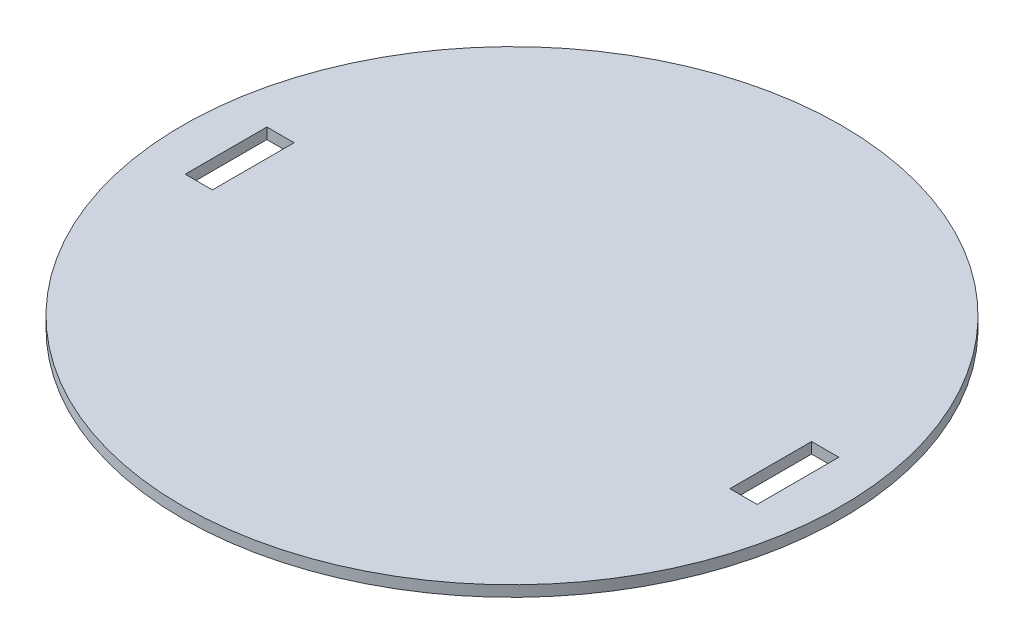
ISO-10303-21;
HEADER;
FILE_DESCRIPTION(('STEP AP214'),'2;1');
FILE_NAME('part.step','',(''),(''),'','','');
FILE_SCHEMA(('AUTOMOTIVE_DESIGN { 1 0 10303 214 1 1 1 1 }'));
ENDSEC;
DATA;
#1=APPLICATION_CONTEXT('core data for automotive mechanical design processes');
#2=APPLICATION_PROTOCOL_DEFINITION('international standard','automotive_design',2000,#1);
#3=PRODUCT_CONTEXT('',#1,'mechanical');
#4=PRODUCT('Part','Part','',(#3));
#5=PRODUCT_RELATED_PRODUCT_CATEGORY('part','',(#4));
#6=PRODUCT_DEFINITION_FORMATION('','',#4);
#7=PRODUCT_DEFINITION_CONTEXT('part definition',#1,'design');
#8=PRODUCT_DEFINITION('design','',#6,#7);
#9=PRODUCT_DEFINITION_SHAPE('','',#8);
#10=(LENGTH_UNIT() NAMED_UNIT(*) SI_UNIT(.MILLI.,.METRE.));
#11=(NAMED_UNIT(*) PLANE_ANGLE_UNIT() SI_UNIT($,.RADIAN.));
#12=(NAMED_UNIT(*) SI_UNIT($,.STERADIAN.) SOLID_ANGLE_UNIT());
#13=UNCERTAINTY_MEASURE_WITH_UNIT(LENGTH_MEASURE(1.E-05),#10,'distance_accuracy_value','');
#14=(GEOMETRIC_REPRESENTATION_CONTEXT(3) GLOBAL_UNCERTAINTY_ASSIGNED_CONTEXT((#13)) GLOBAL_UNIT_ASSIGNED_CONTEXT((#10,
#11,#12)) REPRESENTATION_CONTEXT('',''));
#15=CARTESIAN_POINT('',(0.,0.,0.));
#16=DIRECTION('',(0.,0.,1.));
#17=DIRECTION('',(1.,0.,0.));
#18=AXIS2_PLACEMENT_3D('',#15,#16,#17);
#19=CARTESIAN_POINT('',(0.,3.99999999999999,0.));
#20=DIRECTION('',(0.,1.,0.));
#21=DIRECTION('',(0.,0.,1.));
#22=AXIS2_PLACEMENT_3D('',#19,#20,#21);
#23=PLANE('',#22);
#24=CARTESIAN_POINT('',(0.,3.99999999999999,0.));
#25=DIRECTION('',(0.,1.,0.));
#26=DIRECTION('',(0.,0.,1.));
#27=AXIS2_PLACEMENT_3D('',#24,#25,#26);
#28=CIRCLE('',#27,121.);
#29=CARTESIAN_POINT('',(0.,3.99999999999999,121.));
#30=VERTEX_POINT('',#29);
#31=EDGE_CURVE('E11',#30,#30,#28,.T.);
#32=ORIENTED_EDGE('',*,*,#31,.T.);
#33=EDGE_LOOP('',(#32));
#34=FACE_BOUND('',#33,.T.);
#35=DIRECTION('',(-1.,0.,0.));
#36=VECTOR('',#35,1.);
#37=CARTESIAN_POINT('',(-105.,4.,-15.));
#38=LINE('',#37,#36);
#39=CARTESIAN_POINT('',(-95.0000000000001,4.,-15.));
#40=VERTEX_POINT('',#39);
#41=CARTESIAN_POINT('',(-105.,4.,-15.));
#42=VERTEX_POINT('',#41);
#43=EDGE_CURVE('E135',#40,#42,#38,.T.);
#44=ORIENTED_EDGE('',*,*,#43,.F.);
#45=DIRECTION('',(0.,0.,-1.));
#46=VECTOR('',#45,1.);
#47=CARTESIAN_POINT('',(-95.0000000000001,4.,-15.));
#48=LINE('',#47,#46);
#49=CARTESIAN_POINT('',(-95.0000000000001,3.99999999999997,15.));
#50=VERTEX_POINT('',#49);
#51=EDGE_CURVE('E133',#50,#40,#48,.T.);
#52=ORIENTED_EDGE('',*,*,#51,.F.);
#53=DIRECTION('',(1.,0.,0.));
#54=VECTOR('',#53,1.);
#55=CARTESIAN_POINT('',(-105.,3.99999999999999,15.));
#56=LINE('',#55,#54);
#57=CARTESIAN_POINT('',(-105.,3.99999999999999,15.));
#58=VERTEX_POINT('',#57);
#59=EDGE_CURVE('E141',#58,#50,#56,.T.);
#60=ORIENTED_EDGE('',*,*,#59,.F.);
#61=DIRECTION('',(0.,0.,1.));
#62=VECTOR('',#61,1.);
#63=CARTESIAN_POINT('',(-105.,4.,-15.));
#64=LINE('',#63,#62);
#65=EDGE_CURVE('E138',#42,#58,#64,.T.);
#66=ORIENTED_EDGE('',*,*,#65,.F.);
#67=EDGE_LOOP('',(#44,#52,#60,#66));
#68=FACE_BOUND('',#67,.T.);
#69=DIRECTION('',(-1.,0.,0.));
#70=VECTOR('',#69,1.);
#71=CARTESIAN_POINT('',(105.,3.99999999999999,-15.));
#72=LINE('',#71,#70);
#73=CARTESIAN_POINT('',(105.,3.99999999999999,-15.));
#74=VERTEX_POINT('',#73);
#75=CARTESIAN_POINT('',(95.0000000000001,4.,-15.));
#76=VERTEX_POINT('',#75);
#77=EDGE_CURVE('E105',#74,#76,#72,.T.);
#78=ORIENTED_EDGE('',*,*,#77,.F.);
#79=DIRECTION('',(0.,0.,-1.));
#80=VECTOR('',#79,1.);
#81=CARTESIAN_POINT('',(105.,3.99999999999999,-15.));
#82=LINE('',#81,#80);
#83=CARTESIAN_POINT('',(105.,4.,15.));
#84=VERTEX_POINT('',#83);
#85=EDGE_CURVE('E97',#84,#74,#82,.T.);
#86=ORIENTED_EDGE('',*,*,#85,.F.);
#87=DIRECTION('',(1.,0.,0.));
#88=VECTOR('',#87,1.);
#89=CARTESIAN_POINT('',(105.,4.,15.));
#90=LINE('',#89,#88);
#91=CARTESIAN_POINT('',(95.0000000000002,4.,15.));
#92=VERTEX_POINT('',#91);
#93=EDGE_CURVE('E119',#92,#84,#90,.T.);
#94=ORIENTED_EDGE('',*,*,#93,.F.);
#95=DIRECTION('',(0.,0.,1.));
#96=VECTOR('',#95,1.);
#97=CARTESIAN_POINT('',(95.0000000000001,4.,-15.));
#98=LINE('',#97,#96);
#99=EDGE_CURVE('E117',#76,#92,#98,.T.);
#100=ORIENTED_EDGE('',*,*,#99,.F.);
#101=EDGE_LOOP('',(#78,#86,#94,#100));
#102=FACE_BOUND('',#101,.T.);
#103=ADVANCED_FACE('F32',(#34,#68,#102),#23,.T.);
#104=CARTESIAN_POINT('',(0.,0.,0.));
#105=DIRECTION('',(0.,1.,0.));
#106=DIRECTION('',(0.,0.,1.));
#107=AXIS2_PLACEMENT_3D('',#104,#105,#106);
#108=PLANE('',#107);
#109=DIRECTION('',(0.,0.,-1.));
#110=VECTOR('',#109,1.);
#111=CARTESIAN_POINT('',(-95.0000000000003,0.,-15.));
#112=LINE('',#111,#110);
#113=CARTESIAN_POINT('',(-95.0000000000003,0.,15.));
#114=VERTEX_POINT('',#113);
#115=CARTESIAN_POINT('',(-95.0000000000003,0.,-15.));
#116=VERTEX_POINT('',#115);
#117=EDGE_CURVE('E113',#114,#116,#112,.T.);
#118=ORIENTED_EDGE('',*,*,#117,.T.);
#119=DIRECTION('',(-1.,0.,0.));
#120=VECTOR('',#119,1.);
#121=CARTESIAN_POINT('',(-105.,0.,-15.));
#122=LINE('',#121,#120);
#123=CARTESIAN_POINT('',(-105.,0.,-15.));
#124=VERTEX_POINT('',#123);
#125=EDGE_CURVE('E146',#116,#124,#122,.T.);
#126=ORIENTED_EDGE('',*,*,#125,.T.);
#127=DIRECTION('',(0.,0.,1.));
#128=VECTOR('',#127,1.);
#129=CARTESIAN_POINT('',(-105.,0.,-15.));
#130=LINE('',#129,#128);
#131=CARTESIAN_POINT('',(-105.,0.,15.));
#132=VERTEX_POINT('',#131);
#133=EDGE_CURVE('E149',#124,#132,#130,.T.);
#134=ORIENTED_EDGE('',*,*,#133,.T.);
#135=DIRECTION('',(1.,0.,0.));
#136=VECTOR('',#135,1.);
#137=CARTESIAN_POINT('',(-105.,0.,15.));
#138=LINE('',#137,#136);
#139=EDGE_CURVE('E136',#132,#114,#138,.T.);
#140=ORIENTED_EDGE('',*,*,#139,.T.);
#141=EDGE_LOOP('',(#118,#126,#134,#140));
#142=FACE_BOUND('',#141,.T.);
#143=CARTESIAN_POINT('',(0.,0.,0.));
#144=DIRECTION('',(0.,1.,0.));
#145=DIRECTION('',(0.,0.,1.));
#146=AXIS2_PLACEMENT_3D('',#143,#144,#145);
#147=CIRCLE('',#146,121.);
#148=CARTESIAN_POINT('',(0.,0.,121.));
#149=VERTEX_POINT('',#148);
#150=EDGE_CURVE('E36',#149,#149,#147,.T.);
#151=ORIENTED_EDGE('',*,*,#150,.F.);
#152=EDGE_LOOP('',(#151));
#153=FACE_BOUND('',#152,.T.);
#154=DIRECTION('',(0.,0.,-1.));
#155=VECTOR('',#154,1.);
#156=CARTESIAN_POINT('',(105.,0.,-15.));
#157=LINE('',#156,#155);
#158=CARTESIAN_POINT('',(105.,0.,15.));
#159=VERTEX_POINT('',#158);
#160=CARTESIAN_POINT('',(105.,0.,-15.));
#161=VERTEX_POINT('',#160);
#162=EDGE_CURVE('E55',#159,#161,#157,.T.);
#163=ORIENTED_EDGE('',*,*,#162,.T.);
#164=DIRECTION('',(-1.,0.,0.));
#165=VECTOR('',#164,1.);
#166=CARTESIAN_POINT('',(105.,0.,-15.));
#167=LINE('',#166,#165);
#168=CARTESIAN_POINT('',(95.0000000000001,0.,-15.));
#169=VERTEX_POINT('',#168);
#170=EDGE_CURVE('E112',#161,#169,#167,.T.);
#171=ORIENTED_EDGE('',*,*,#170,.T.);
#172=DIRECTION('',(0.,0.,1.));
#173=VECTOR('',#172,1.);
#174=CARTESIAN_POINT('',(95.0000000000001,0.,-15.));
#175=LINE('',#174,#173);
#176=CARTESIAN_POINT('',(95.0000000000002,0.,15.));
#177=VERTEX_POINT('',#176);
#178=EDGE_CURVE('E125',#169,#177,#175,.T.);
#179=ORIENTED_EDGE('',*,*,#178,.T.);
#180=DIRECTION('',(1.,0.,0.));
#181=VECTOR('',#180,1.);
#182=CARTESIAN_POINT('',(105.,0.,15.));
#183=LINE('',#182,#181);
#184=EDGE_CURVE('E106',#177,#159,#183,.T.);
#185=ORIENTED_EDGE('',*,*,#184,.T.);
#186=EDGE_LOOP('',(#163,#171,#179,#185));
#187=FACE_BOUND('',#186,.T.);
#188=ADVANCED_FACE('F168',(#142,#153,#187),#108,.F.);
#189=CARTESIAN_POINT('',(0.,3.99999999999999,0.));
#190=DIRECTION('',(0.,-1.,0.));
#191=DIRECTION('',(0.,0.,-1.));
#192=AXIS2_PLACEMENT_3D('',#189,#190,#191);
#193=CYLINDRICAL_SURFACE('',#192,121.);
#194=ORIENTED_EDGE('',*,*,#31,.F.);
#195=EDGE_LOOP('',(#194));
#196=FACE_BOUND('',#195,.T.);
#197=ORIENTED_EDGE('',*,*,#150,.T.);
#198=EDGE_LOOP('',(#197));
#199=FACE_BOUND('',#198,.T.);
#200=ADVANCED_FACE('F34',(#196,#199),#193,.T.);
#201=CARTESIAN_POINT('',(-95.0000000000001,4.,-15.));
#202=DIRECTION('',(-1.,0.,0.));
#203=DIRECTION('',(0.,0.,1.));
#204=AXIS2_PLACEMENT_3D('',#201,#202,#203);
#205=PLANE('',#204);
#206=ORIENTED_EDGE('',*,*,#117,.F.);
#207=DIRECTION('',(0.,-1.,0.));
#208=VECTOR('',#207,1.);
#209=CARTESIAN_POINT('',(-95.0000000000001,3.99999999999997,15.));
#210=LINE('',#209,#208);
#211=EDGE_CURVE('E143',#50,#114,#210,.T.);
#212=ORIENTED_EDGE('',*,*,#211,.F.);
#213=ORIENTED_EDGE('',*,*,#51,.T.);
#214=DIRECTION('',(0.,-1.,0.));
#215=VECTOR('',#214,1.);
#216=CARTESIAN_POINT('',(-95.0000000000001,4.,-15.));
#217=LINE('',#216,#215);
#218=EDGE_CURVE('E160',#40,#116,#217,.T.);
#219=ORIENTED_EDGE('',*,*,#218,.T.);
#220=EDGE_LOOP('',(#206,#212,#213,#219));
#221=FACE_BOUND('',#220,.T.);
#222=ADVANCED_FACE('F189',(#221),#205,.T.);
#223=CARTESIAN_POINT('',(-105.,4.,-15.));
#224=DIRECTION('',(0.,0.,1.));
#225=DIRECTION('',(1.,0.,0.));
#226=AXIS2_PLACEMENT_3D('',#223,#224,#225);
#227=PLANE('',#226);
#228=ORIENTED_EDGE('',*,*,#125,.F.);
#229=ORIENTED_EDGE('',*,*,#218,.F.);
#230=ORIENTED_EDGE('',*,*,#43,.T.);
#231=DIRECTION('',(0.,-1.,0.));
#232=VECTOR('',#231,1.);
#233=CARTESIAN_POINT('',(-105.,4.,-15.));
#234=LINE('',#233,#232);
#235=EDGE_CURVE('E158',#42,#124,#234,.T.);
#236=ORIENTED_EDGE('',*,*,#235,.T.);
#237=EDGE_LOOP('',(#228,#229,#230,#236));
#238=FACE_BOUND('',#237,.T.);
#239=ADVANCED_FACE('F192',(#238),#227,.T.);
#240=CARTESIAN_POINT('',(-105.,4.,-15.));
#241=DIRECTION('',(1.,0.,0.));
#242=DIRECTION('',(0.,0.,-1.));
#243=AXIS2_PLACEMENT_3D('',#240,#241,#242);
#244=PLANE('',#243);
#245=ORIENTED_EDGE('',*,*,#133,.F.);
#246=ORIENTED_EDGE('',*,*,#235,.F.);
#247=ORIENTED_EDGE('',*,*,#65,.T.);
#248=DIRECTION('',(0.,-1.,0.));
#249=VECTOR('',#248,1.);
#250=CARTESIAN_POINT('',(-105.,3.99999999999999,15.));
#251=LINE('',#250,#249);
#252=EDGE_CURVE('E156',#58,#132,#251,.T.);
#253=ORIENTED_EDGE('',*,*,#252,.T.);
#254=EDGE_LOOP('',(#245,#246,#247,#253));
#255=FACE_BOUND('',#254,.T.);
#256=ADVANCED_FACE('F195',(#255),#244,.T.);
#257=CARTESIAN_POINT('',(-105.,3.99999999999999,15.));
#258=DIRECTION('',(0.,0.,-1.));
#259=DIRECTION('',(-1.,0.,0.));
#260=AXIS2_PLACEMENT_3D('',#257,#258,#259);
#261=PLANE('',#260);
#262=ORIENTED_EDGE('',*,*,#139,.F.);
#263=ORIENTED_EDGE('',*,*,#252,.F.);
#264=ORIENTED_EDGE('',*,*,#59,.T.);
#265=ORIENTED_EDGE('',*,*,#211,.T.);
#266=EDGE_LOOP('',(#262,#263,#264,#265));
#267=FACE_BOUND('',#266,.T.);
#268=ADVANCED_FACE('F199',(#267),#261,.T.);
#269=CARTESIAN_POINT('',(105.,3.99999999999999,-15.));
#270=DIRECTION('',(-1.,0.,0.));
#271=DIRECTION('',(0.,0.,1.));
#272=AXIS2_PLACEMENT_3D('',#269,#270,#271);
#273=PLANE('',#272);
#274=ORIENTED_EDGE('',*,*,#162,.F.);
#275=DIRECTION('',(0.,-1.,0.));
#276=VECTOR('',#275,1.);
#277=CARTESIAN_POINT('',(105.,4.,15.));
#278=LINE('',#277,#276);
#279=EDGE_CURVE('E101',#84,#159,#278,.T.);
#280=ORIENTED_EDGE('',*,*,#279,.F.);
#281=ORIENTED_EDGE('',*,*,#85,.T.);
#282=DIRECTION('',(0.,-1.,0.));
#283=VECTOR('',#282,1.);
#284=CARTESIAN_POINT('',(105.,3.99999999999999,-15.));
#285=LINE('',#284,#283);
#286=EDGE_CURVE('E100',#74,#161,#285,.T.);
#287=ORIENTED_EDGE('',*,*,#286,.T.);
#288=EDGE_LOOP('',(#274,#280,#281,#287));
#289=FACE_BOUND('',#288,.T.);
#290=ADVANCED_FACE('F99',(#289),#273,.T.);
#291=CARTESIAN_POINT('',(105.,3.99999999999999,-15.));
#292=DIRECTION('',(0.,0.,1.));
#293=DIRECTION('',(1.,0.,0.));
#294=AXIS2_PLACEMENT_3D('',#291,#292,#293);
#295=PLANE('',#294);
#296=ORIENTED_EDGE('',*,*,#170,.F.);
#297=ORIENTED_EDGE('',*,*,#286,.F.);
#298=ORIENTED_EDGE('',*,*,#77,.T.);
#299=DIRECTION('',(0.,-1.,0.));
#300=VECTOR('',#299,1.);
#301=CARTESIAN_POINT('',(95.0000000000001,4.,-15.));
#302=LINE('',#301,#300);
#303=EDGE_CURVE('E114',#76,#169,#302,.T.);
#304=ORIENTED_EDGE('',*,*,#303,.T.);
#305=EDGE_LOOP('',(#296,#297,#298,#304));
#306=FACE_BOUND('',#305,.T.);
#307=ADVANCED_FACE('F109',(#306),#295,.T.);
#308=CARTESIAN_POINT('',(95.0000000000001,4.,-15.));
#309=DIRECTION('',(1.,0.,0.));
#310=DIRECTION('',(0.,0.,-1.));
#311=AXIS2_PLACEMENT_3D('',#308,#309,#310);
#312=PLANE('',#311);
#313=ORIENTED_EDGE('',*,*,#178,.F.);
#314=ORIENTED_EDGE('',*,*,#303,.F.);
#315=ORIENTED_EDGE('',*,*,#99,.T.);
#316=DIRECTION('',(0.,-1.,0.));
#317=VECTOR('',#316,1.);
#318=CARTESIAN_POINT('',(95.0000000000002,4.,15.));
#319=LINE('',#318,#317);
#320=EDGE_CURVE('E47',#92,#177,#319,.T.);
#321=ORIENTED_EDGE('',*,*,#320,.T.);
#322=EDGE_LOOP('',(#313,#314,#315,#321));
#323=FACE_BOUND('',#322,.T.);
#324=ADVANCED_FACE('F175',(#323),#312,.T.);
#325=CARTESIAN_POINT('',(105.,4.,15.));
#326=DIRECTION('',(0.,0.,-1.));
#327=DIRECTION('',(-1.,0.,0.));
#328=AXIS2_PLACEMENT_3D('',#325,#326,#327);
#329=PLANE('',#328);
#330=ORIENTED_EDGE('',*,*,#184,.F.);
#331=ORIENTED_EDGE('',*,*,#320,.F.);
#332=ORIENTED_EDGE('',*,*,#93,.T.);
#333=ORIENTED_EDGE('',*,*,#279,.T.);
#334=EDGE_LOOP('',(#330,#331,#332,#333));
#335=FACE_BOUND('',#334,.T.);
#336=ADVANCED_FACE('F173',(#335),#329,.T.);
#337=CLOSED_SHELL('',(#103,#188,#200,#222,#239,#256,#268,#290,#307,#324,#336));
#338=MANIFOLD_SOLID_BREP('B2',#337);
#339=ADVANCED_BREP_SHAPE_REPRESENTATION('',(#18,#338),#14);
#340=SHAPE_DEFINITION_REPRESENTATION(#9,#339);
ENDSEC;
END-ISO-10303-21;
